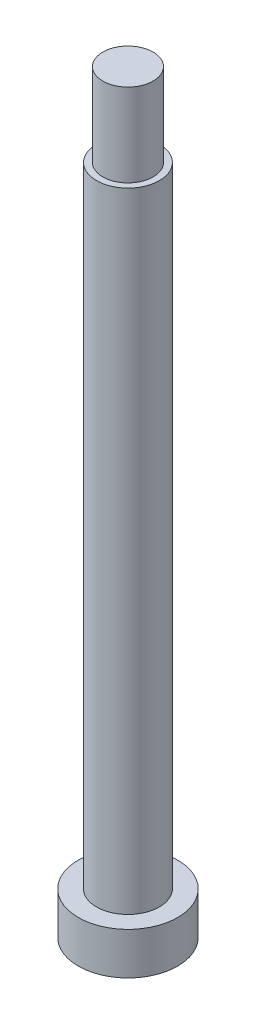
ISO-10303-21;
HEADER;
FILE_DESCRIPTION(('STEP AP214'),'2;1');
FILE_NAME('part.step','',(''),(''),'','','');
FILE_SCHEMA(('AUTOMOTIVE_DESIGN { 1 0 10303 214 1 1 1 1 }'));
ENDSEC;
DATA;
#1=APPLICATION_CONTEXT('core data for automotive mechanical design processes');
#2=APPLICATION_PROTOCOL_DEFINITION('international standard','automotive_design',2000,#1);
#3=PRODUCT_CONTEXT('',#1,'mechanical');
#4=PRODUCT('Part','Part','',(#3));
#5=PRODUCT_RELATED_PRODUCT_CATEGORY('part','',(#4));
#6=PRODUCT_DEFINITION_FORMATION('','',#4);
#7=PRODUCT_DEFINITION_CONTEXT('part definition',#1,'design');
#8=PRODUCT_DEFINITION('design','',#6,#7);
#9=PRODUCT_DEFINITION_SHAPE('','',#8);
#10=(LENGTH_UNIT() NAMED_UNIT(*) SI_UNIT(.MILLI.,.METRE.));
#11=(NAMED_UNIT(*) PLANE_ANGLE_UNIT() SI_UNIT($,.RADIAN.));
#12=(NAMED_UNIT(*) SI_UNIT($,.STERADIAN.) SOLID_ANGLE_UNIT());
#13=UNCERTAINTY_MEASURE_WITH_UNIT(LENGTH_MEASURE(1.E-05),#10,'distance_accuracy_value','');
#14=(GEOMETRIC_REPRESENTATION_CONTEXT(3) GLOBAL_UNCERTAINTY_ASSIGNED_CONTEXT((#13)) GLOBAL_UNIT_ASSIGNED_CONTEXT((#10,
#11,#12)) REPRESENTATION_CONTEXT('',''));
#15=CARTESIAN_POINT('',(0.,0.,0.));
#16=DIRECTION('',(0.,0.,1.));
#17=DIRECTION('',(1.,0.,0.));
#18=AXIS2_PLACEMENT_3D('',#15,#16,#17);
#19=CARTESIAN_POINT('',(0.,119.9,0.));
#20=DIRECTION('',(0.,-1.,0.));
#21=DIRECTION('',(0.,0.,-1.));
#22=AXIS2_PLACEMENT_3D('',#19,#20,#21);
#23=CYLINDRICAL_SURFACE('',#22,4.);
#24=CARTESIAN_POINT('',(0.,106.7,0.));
#25=DIRECTION('',(0.,1.,0.));
#26=DIRECTION('',(0.,0.,1.));
#27=AXIS2_PLACEMENT_3D('',#24,#25,#26);
#28=CIRCLE('',#27,4.);
#29=CARTESIAN_POINT('',(0.,106.7,4.));
#30=VERTEX_POINT('',#29);
#31=EDGE_CURVE('E579',#30,#30,#28,.T.);
#32=ORIENTED_EDGE('',*,*,#31,.T.);
#33=EDGE_LOOP('',(#32));
#34=FACE_BOUND('',#33,.T.);
#35=CARTESIAN_POINT('',(0.,119.9,0.));
#36=DIRECTION('',(0.,1.,0.));
#37=DIRECTION('',(0.,0.,1.));
#38=AXIS2_PLACEMENT_3D('',#35,#36,#37);
#39=CIRCLE('',#38,4.);
#40=CARTESIAN_POINT('',(0.,119.9,4.));
#41=VERTEX_POINT('',#40);
#42=EDGE_CURVE('E12',#41,#41,#39,.T.);
#43=ORIENTED_EDGE('',*,*,#42,.F.);
#44=EDGE_LOOP('',(#43));
#45=FACE_BOUND('',#44,.T.);
#46=ADVANCED_FACE('F464',(#34,#45),#23,.T.);
#47=CARTESIAN_POINT('',(0.,119.9,0.));
#48=DIRECTION('',(0.,1.,0.));
#49=DIRECTION('',(0.,0.,1.));
#50=AXIS2_PLACEMENT_3D('',#47,#48,#49);
#51=PLANE('',#50);
#52=ORIENTED_EDGE('',*,*,#42,.T.);
#53=EDGE_LOOP('',(#52));
#54=FACE_BOUND('',#53,.T.);
#55=ADVANCED_FACE('F587',(#54),#51,.T.);
#56=CARTESIAN_POINT('',(0.,106.7,0.));
#57=DIRECTION('',(0.,-1.,0.));
#58=DIRECTION('',(0.,0.,-1.));
#59=AXIS2_PLACEMENT_3D('',#56,#57,#58);
#60=CYLINDRICAL_SURFACE('',#59,5.);
#61=CARTESIAN_POINT('',(0.,6.7,0.));
#62=DIRECTION('',(0.,1.,0.));
#63=DIRECTION('',(0.,0.,1.));
#64=AXIS2_PLACEMENT_3D('',#61,#62,#63);
#65=CIRCLE('',#64,5.);
#66=CARTESIAN_POINT('',(0.,6.70000000000001,-5.));
#67=VERTEX_POINT('',#66);
#68=EDGE_CURVE('E575',#67,#67,#65,.T.);
#69=CARTESIAN_POINT('',(0.,106.7,0.));
#70=DIRECTION('',(0.,1.,0.));
#71=DIRECTION('',(0.,0.,1.));
#72=AXIS2_PLACEMENT_3D('',#69,#70,#71);
#73=CIRCLE('',#72,5.);
#74=CARTESIAN_POINT('',(0.,106.7,-5.));
#75=VERTEX_POINT('',#74);
#76=EDGE_CURVE('E471',#75,#75,#73,.T.);
#77=CARTESIAN_POINT('',(0.,6.70000000000001,-5.));
#78=CARTESIAN_POINT('',(0.,7.74166666666668,-5.));
#79=CARTESIAN_POINT('',(0.,8.78333333333335,-5.));
#80=CARTESIAN_POINT('',(0.,10.8666666666667,-5.));
#81=CARTESIAN_POINT('',(0.,11.9083333333333,-5.));
#82=CARTESIAN_POINT('',(0.,13.9916666666667,-5.));
#83=CARTESIAN_POINT('',(0.,15.0333333333333,-5.));
#84=CARTESIAN_POINT('',(0.,17.1166666666667,-5.));
#85=CARTESIAN_POINT('',(0.,18.1583333333333,-5.));
#86=CARTESIAN_POINT('',(0.,20.2416666666667,-5.));
#87=CARTESIAN_POINT('',(0.,21.2833333333333,-5.));
#88=CARTESIAN_POINT('',(0.,23.3666666666667,-5.));
#89=CARTESIAN_POINT('',(0.,24.4083333333333,-5.));
#90=CARTESIAN_POINT('',(0.,26.4916666666667,-5.));
#91=CARTESIAN_POINT('',(0.,27.5333333333333,-5.));
#92=CARTESIAN_POINT('',(0.,29.6166666666667,-5.));
#93=CARTESIAN_POINT('',(0.,30.6583333333333,-5.));
#94=CARTESIAN_POINT('',(0.,32.7416666666667,-5.));
#95=CARTESIAN_POINT('',(0.,33.7833333333333,-5.));
#96=CARTESIAN_POINT('',(0.,35.8666666666667,-5.));
#97=CARTESIAN_POINT('',(0.,36.9083333333333,-5.));
#98=CARTESIAN_POINT('',(0.,38.9916666666667,-5.));
#99=CARTESIAN_POINT('',(0.,40.0333333333333,-5.));
#100=CARTESIAN_POINT('',(0.,42.1166666666667,-5.));
#101=CARTESIAN_POINT('',(0.,43.1583333333333,-5.));
#102=CARTESIAN_POINT('',(0.,45.2416666666667,-5.));
#103=CARTESIAN_POINT('',(0.,46.2833333333333,-5.));
#104=CARTESIAN_POINT('',(0.,48.3666666666667,-5.));
#105=CARTESIAN_POINT('',(0.,49.4083333333333,-5.));
#106=CARTESIAN_POINT('',(0.,51.4916666666667,-5.));
#107=CARTESIAN_POINT('',(0.,52.5333333333333,-5.));
#108=CARTESIAN_POINT('',(0.,54.6166666666667,-5.));
#109=CARTESIAN_POINT('',(0.,55.6583333333333,-5.));
#110=CARTESIAN_POINT('',(0.,57.7416666666667,-5.));
#111=CARTESIAN_POINT('',(0.,58.7833333333333,-5.));
#112=CARTESIAN_POINT('',(0.,60.8666666666667,-5.));
#113=CARTESIAN_POINT('',(0.,61.9083333333333,-5.));
#114=CARTESIAN_POINT('',(0.,63.9916666666667,-5.));
#115=CARTESIAN_POINT('',(0.,65.0333333333333,-5.));
#116=CARTESIAN_POINT('',(0.,67.1166666666667,-5.));
#117=CARTESIAN_POINT('',(0.,68.1583333333333,-5.));
#118=CARTESIAN_POINT('',(0.,70.2416666666667,-5.));
#119=CARTESIAN_POINT('',(0.,71.2833333333333,-5.));
#120=CARTESIAN_POINT('',(0.,73.3666666666667,-5.));
#121=CARTESIAN_POINT('',(0.,74.4083333333333,-5.));
#122=CARTESIAN_POINT('',(0.,76.4916666666666,-5.));
#123=CARTESIAN_POINT('',(0.,77.5333333333333,-5.));
#124=CARTESIAN_POINT('',(0.,79.6166666666667,-5.));
#125=CARTESIAN_POINT('',(0.,80.6583333333333,-5.));
#126=CARTESIAN_POINT('',(0.,82.7416666666667,-5.));
#127=CARTESIAN_POINT('',(0.,83.7833333333333,-5.));
#128=CARTESIAN_POINT('',(0.,85.8666666666667,-5.));
#129=CARTESIAN_POINT('',(0.,86.9083333333333,-5.));
#130=CARTESIAN_POINT('',(0.,88.9916666666666,-5.));
#131=CARTESIAN_POINT('',(0.,90.0333333333333,-5.));
#132=CARTESIAN_POINT('',(0.,92.1166666666666,-5.));
#133=CARTESIAN_POINT('',(0.,93.1583333333333,-5.));
#134=CARTESIAN_POINT('',(0.,95.2416666666667,-5.));
#135=CARTESIAN_POINT('',(0.,96.2833333333333,-5.));
#136=CARTESIAN_POINT('',(0.,98.3666666666667,-5.));
#137=CARTESIAN_POINT('',(0.,99.4083333333333,-5.));
#138=CARTESIAN_POINT('',(0.,101.491666666667,-5.));
#139=CARTESIAN_POINT('',(0.,102.533333333333,-5.));
#140=CARTESIAN_POINT('',(0.,104.616666666667,-5.));
#141=CARTESIAN_POINT('',(0.,105.658333333333,-5.));
#142=CARTESIAN_POINT('',(0.,106.7,-5.));
#143=B_SPLINE_CURVE_WITH_KNOTS('',3,(#77,#78,#79,#80,#81,#82,#83,#84,#85,#86,#87,#88,#89,#90,
#91,#92,#93,#94,#95,#96,#97,#98,#99,#100,#101,#102,#103,#104,#105,#106,#107,#108,#109,#110,#111,
#112,#113,#114,#115,#116,#117,#118,#119,#120,#121,#122,#123,#124,#125,#126,#127,#128,#129,#130,
#131,#132,#133,#134,#135,#136,#137,#138,#139,#140,#141,#142),.UNSPECIFIED.,.F.,.F.,(4,2,2,2,2,2,
2,2,2,2,2,2,2,2,2,2,2,2,2,2,2,2,2,2,2,2,2,2,2,2,2,2,4),(0.,3.125,6.25000000000001,
9.37499999999999,12.5,15.625,18.75,21.875,25.,28.125,31.25,34.375,37.5,40.625,43.75,46.875,50.,
53.125,56.25,59.375,62.5,65.625,68.75,71.875,75.,78.125,81.25,84.375,87.5,90.625,93.75,96.875,
100.),.UNSPECIFIED.);
#144=EDGE_CURVE('BSEAM590',#67,#75,#143,.T.);
#145=ORIENTED_EDGE('',*,*,#68,.T.);
#146=ORIENTED_EDGE('',*,*,#76,.F.);
#147=ORIENTED_EDGE('',*,*,#144,.T.);
#148=ORIENTED_EDGE('',*,*,#144,.F.);
#149=EDGE_LOOP('',(#145,#147,#146,#148));
#150=FACE_BOUND('',#149,.T.);
#151=ADVANCED_FACE('F590',(#150),#60,.T.);
#152=CARTESIAN_POINT('',(0.,106.7,0.));
#153=DIRECTION('',(0.,1.,0.));
#154=DIRECTION('',(0.,0.,1.));
#155=AXIS2_PLACEMENT_3D('',#152,#153,#154);
#156=PLANE('',#155);
#157=ORIENTED_EDGE('',*,*,#31,.F.);
#158=EDGE_LOOP('',(#157));
#159=FACE_BOUND('',#158,.T.);
#160=ORIENTED_EDGE('',*,*,#76,.T.);
#161=EDGE_LOOP('',(#160));
#162=FACE_BOUND('',#161,.T.);
#163=ADVANCED_FACE('F582',(#159,#162),#156,.T.);
#164=CARTESIAN_POINT('',(0.,6.7,0.));
#165=DIRECTION('',(0.,-1.,0.));
#166=DIRECTION('',(0.,0.,-1.));
#167=AXIS2_PLACEMENT_3D('',#164,#165,#166);
#168=CYLINDRICAL_SURFACE('',#167,7.9);
#169=CARTESIAN_POINT('',(0.,6.7,0.));
#170=DIRECTION('',(0.,1.,0.));
#171=DIRECTION('',(0.,0.,1.));
#172=AXIS2_PLACEMENT_3D('',#169,#170,#171);
#173=CIRCLE('',#172,7.9);
#174=CARTESIAN_POINT('',(0.,6.7,7.9));
#175=VERTEX_POINT('',#174);
#176=EDGE_CURVE('E574',#175,#175,#173,.T.);
#177=ORIENTED_EDGE('',*,*,#176,.F.);
#178=EDGE_LOOP('',(#177));
#179=FACE_BOUND('',#178,.T.);
#180=CARTESIAN_POINT('',(0.,0.,0.));
#181=DIRECTION('',(0.,1.,0.));
#182=DIRECTION('',(0.,0.,1.));
#183=AXIS2_PLACEMENT_3D('',#180,#181,#182);
#184=CIRCLE('',#183,7.9);
#185=CARTESIAN_POINT('',(0.,0.,7.9));
#186=VERTEX_POINT('',#185);
#187=EDGE_CURVE('E566',#186,#186,#184,.T.);
#188=ORIENTED_EDGE('',*,*,#187,.T.);
#189=EDGE_LOOP('',(#188));
#190=FACE_BOUND('',#189,.T.);
#191=ADVANCED_FACE('F597',(#179,#190),#168,.T.);
#192=CARTESIAN_POINT('',(0.,6.7,0.));
#193=DIRECTION('',(0.,1.,0.));
#194=DIRECTION('',(0.,0.,1.));
#195=AXIS2_PLACEMENT_3D('',#192,#193,#194);
#196=PLANE('',#195);
#197=ORIENTED_EDGE('',*,*,#68,.F.);
#198=EDGE_LOOP('',(#197));
#199=FACE_BOUND('',#198,.T.);
#200=ORIENTED_EDGE('',*,*,#176,.T.);
#201=EDGE_LOOP('',(#200));
#202=FACE_BOUND('',#201,.T.);
#203=ADVANCED_FACE('F633',(#199,#202),#196,.T.);
#204=CARTESIAN_POINT('',(0.,0.,0.));
#205=DIRECTION('',(0.,1.,0.));
#206=DIRECTION('',(0.,0.,1.));
#207=AXIS2_PLACEMENT_3D('',#204,#205,#206);
#208=PLANE('',#207);
#209=DIRECTION('',(-0.866025403784439,0.,0.5));
#210=VECTOR('',#209,1.);
#211=CARTESIAN_POINT('',(2.5,0.,1.44337567297406));
#212=LINE('',#211,#210);
#213=CARTESIAN_POINT('',(2.5,0.,1.44337567297406));
#214=VERTEX_POINT('',#213);
#215=CARTESIAN_POINT('',(0.,0.,2.88675134594813));
#216=VERTEX_POINT('',#215);
#217=EDGE_CURVE('E551',#214,#216,#212,.T.);
#218=ORIENTED_EDGE('',*,*,#217,.F.);
#219=DIRECTION('',(0.,0.,1.));
#220=VECTOR('',#219,1.);
#221=CARTESIAN_POINT('',(2.5,0.,-1.44337567297406));
#222=LINE('',#221,#220);
#223=CARTESIAN_POINT('',(2.5,0.,-1.44337567297406));
#224=VERTEX_POINT('',#223);
#225=EDGE_CURVE('E477',#224,#214,#222,.T.);
#226=ORIENTED_EDGE('',*,*,#225,.F.);
#227=DIRECTION('',(0.866025403784439,0.,0.5));
#228=VECTOR('',#227,1.);
#229=CARTESIAN_POINT('',(0.,0.,-2.88675134594813));
#230=LINE('',#229,#228);
#231=CARTESIAN_POINT('',(0.,0.,-2.88675134594813));
#232=VERTEX_POINT('',#231);
#233=EDGE_CURVE('E565',#232,#224,#230,.T.);
#234=ORIENTED_EDGE('',*,*,#233,.F.);
#235=DIRECTION('',(0.866025403784439,0.,-0.5));
#236=VECTOR('',#235,1.);
#237=CARTESIAN_POINT('',(-2.5,0.,-1.44337567297407));
#238=LINE('',#237,#236);
#239=CARTESIAN_POINT('',(-2.5,0.,-1.44337567297407));
#240=VERTEX_POINT('',#239);
#241=EDGE_CURVE('E557',#240,#232,#238,.T.);
#242=ORIENTED_EDGE('',*,*,#241,.F.);
#243=DIRECTION('',(0.,0.,-1.));
#244=VECTOR('',#243,1.);
#245=CARTESIAN_POINT('',(-2.5,0.,1.44337567297406));
#246=LINE('',#245,#244);
#247=CARTESIAN_POINT('',(-2.5,0.,1.44337567297406));
#248=VERTEX_POINT('',#247);
#249=EDGE_CURVE('E530',#248,#240,#246,.T.);
#250=ORIENTED_EDGE('',*,*,#249,.F.);
#251=DIRECTION('',(-0.866025403784439,0.,-0.5));
#252=VECTOR('',#251,1.);
#253=CARTESIAN_POINT('',(0.,0.,2.88675134594813));
#254=LINE('',#253,#252);
#255=EDGE_CURVE('E558',#216,#248,#254,.T.);
#256=ORIENTED_EDGE('',*,*,#255,.F.);
#257=EDGE_LOOP('',(#218,#226,#234,#242,#250,#256));
#258=FACE_BOUND('',#257,.T.);
#259=ORIENTED_EDGE('',*,*,#187,.F.);
#260=EDGE_LOOP('',(#259));
#261=FACE_BOUND('',#260,.T.);
#262=ADVANCED_FACE('F626',(#258,#261),#208,.F.);
#263=CARTESIAN_POINT('',(2.5,3.,-1.44337567297406));
#264=DIRECTION('',(1.,0.,0.));
#265=DIRECTION('',(0.,0.,-1.));
#266=AXIS2_PLACEMENT_3D('',#263,#264,#265);
#267=PLANE('',#266);
#268=ORIENTED_EDGE('',*,*,#225,.T.);
#269=DIRECTION('',(0.,-1.,0.));
#270=VECTOR('',#269,1.);
#271=CARTESIAN_POINT('',(2.5,3.,1.44337567297406));
#272=LINE('',#271,#270);
#273=CARTESIAN_POINT('',(2.5,3.,1.44337567297406));
#274=VERTEX_POINT('',#273);
#275=EDGE_CURVE('E508',#274,#214,#272,.T.);
#276=ORIENTED_EDGE('',*,*,#275,.F.);
#277=DIRECTION('',(0.,0.,1.));
#278=VECTOR('',#277,1.);
#279=CARTESIAN_POINT('',(2.5,3.,-1.44337567297406));
#280=LINE('',#279,#278);
#281=CARTESIAN_POINT('',(2.5,3.,-1.44337567297406));
#282=VERTEX_POINT('',#281);
#283=EDGE_CURVE('E562',#282,#274,#280,.T.);
#284=ORIENTED_EDGE('',*,*,#283,.F.);
#285=DIRECTION('',(0.,-1.,0.));
#286=VECTOR('',#285,1.);
#287=CARTESIAN_POINT('',(2.5,3.,-1.44337567297406));
#288=LINE('',#287,#286);
#289=EDGE_CURVE('E487',#282,#224,#288,.T.);
#290=ORIENTED_EDGE('',*,*,#289,.T.);
#291=EDGE_LOOP('',(#268,#276,#284,#290));
#292=FACE_BOUND('',#291,.T.);
#293=ADVANCED_FACE('F635',(#292),#267,.F.);
#294=CARTESIAN_POINT('',(0.,3.,-2.88675134594813));
#295=DIRECTION('',(0.5,0.,-0.866025403784439));
#296=DIRECTION('',(-0.866025403784439,0.,-0.5));
#297=AXIS2_PLACEMENT_3D('',#294,#295,#296);
#298=PLANE('',#297);
#299=ORIENTED_EDGE('',*,*,#233,.T.);
#300=ORIENTED_EDGE('',*,*,#289,.F.);
#301=DIRECTION('',(0.866025403784439,0.,0.5));
#302=VECTOR('',#301,1.);
#303=CARTESIAN_POINT('',(0.,3.,-2.88675134594813));
#304=LINE('',#303,#302);
#305=CARTESIAN_POINT('',(0.,3.,-2.88675134594813));
#306=VERTEX_POINT('',#305);
#307=EDGE_CURVE('E538',#306,#282,#304,.T.);
#308=ORIENTED_EDGE('',*,*,#307,.F.);
#309=DIRECTION('',(0.,-1.,0.));
#310=VECTOR('',#309,1.);
#311=CARTESIAN_POINT('',(0.,3.,-2.88675134594813));
#312=LINE('',#311,#310);
#313=EDGE_CURVE('E532',#306,#232,#312,.T.);
#314=ORIENTED_EDGE('',*,*,#313,.T.);
#315=EDGE_LOOP('',(#299,#300,#308,#314));
#316=FACE_BOUND('',#315,.T.);
#317=ADVANCED_FACE('F662',(#316),#298,.F.);
#318=CARTESIAN_POINT('',(-2.5,3.,-1.44337567297407));
#319=DIRECTION('',(-0.5,0.,-0.866025403784439));
#320=DIRECTION('',(-0.866025403784439,0.,0.5));
#321=AXIS2_PLACEMENT_3D('',#318,#319,#320);
#322=PLANE('',#321);
#323=ORIENTED_EDGE('',*,*,#241,.T.);
#324=ORIENTED_EDGE('',*,*,#313,.F.);
#325=DIRECTION('',(0.866025403784439,0.,-0.5));
#326=VECTOR('',#325,1.);
#327=CARTESIAN_POINT('',(-2.5,3.,-1.44337567297407));
#328=LINE('',#327,#326);
#329=CARTESIAN_POINT('',(-2.5,3.,-1.44337567297407));
#330=VERTEX_POINT('',#329);
#331=EDGE_CURVE('E533',#330,#306,#328,.T.);
#332=ORIENTED_EDGE('',*,*,#331,.F.);
#333=DIRECTION('',(0.,-1.,0.));
#334=VECTOR('',#333,1.);
#335=CARTESIAN_POINT('',(-2.5,3.,-1.44337567297407));
#336=LINE('',#335,#334);
#337=EDGE_CURVE('E517',#330,#240,#336,.T.);
#338=ORIENTED_EDGE('',*,*,#337,.T.);
#339=EDGE_LOOP('',(#323,#324,#332,#338));
#340=FACE_BOUND('',#339,.T.);
#341=ADVANCED_FACE('F539',(#340),#322,.F.);
#342=CARTESIAN_POINT('',(-2.5,3.,1.44337567297406));
#343=DIRECTION('',(-1.,0.,0.));
#344=DIRECTION('',(0.,0.,1.));
#345=AXIS2_PLACEMENT_3D('',#342,#343,#344);
#346=PLANE('',#345);
#347=ORIENTED_EDGE('',*,*,#249,.T.);
#348=ORIENTED_EDGE('',*,*,#337,.F.);
#349=DIRECTION('',(0.,0.,-1.));
#350=VECTOR('',#349,1.);
#351=CARTESIAN_POINT('',(-2.5,3.,1.44337567297406));
#352=LINE('',#351,#350);
#353=CARTESIAN_POINT('',(-2.5,3.,1.44337567297406));
#354=VERTEX_POINT('',#353);
#355=EDGE_CURVE('E522',#354,#330,#352,.T.);
#356=ORIENTED_EDGE('',*,*,#355,.F.);
#357=DIRECTION('',(0.,-1.,0.));
#358=VECTOR('',#357,1.);
#359=CARTESIAN_POINT('',(-2.5,3.,1.44337567297406));
#360=LINE('',#359,#358);
#361=EDGE_CURVE('E535',#354,#248,#360,.T.);
#362=ORIENTED_EDGE('',*,*,#361,.T.);
#363=EDGE_LOOP('',(#347,#348,#356,#362));
#364=FACE_BOUND('',#363,.T.);
#365=ADVANCED_FACE('F525',(#364),#346,.F.);
#366=CARTESIAN_POINT('',(0.,3.,2.88675134594813));
#367=DIRECTION('',(-0.5,0.,0.866025403784438));
#368=DIRECTION('',(0.866025403784439,0.,0.5));
#369=AXIS2_PLACEMENT_3D('',#366,#367,#368);
#370=PLANE('',#369);
#371=ORIENTED_EDGE('',*,*,#255,.T.);
#372=ORIENTED_EDGE('',*,*,#361,.F.);
#373=DIRECTION('',(-0.866025403784439,0.,-0.5));
#374=VECTOR('',#373,1.);
#375=CARTESIAN_POINT('',(0.,3.,2.88675134594813));
#376=LINE('',#375,#374);
#377=CARTESIAN_POINT('',(0.,3.,2.88675134594813));
#378=VERTEX_POINT('',#377);
#379=EDGE_CURVE('E544',#378,#354,#376,.T.);
#380=ORIENTED_EDGE('',*,*,#379,.F.);
#381=DIRECTION('',(0.,-1.,0.));
#382=VECTOR('',#381,1.);
#383=CARTESIAN_POINT('',(0.,3.,2.88675134594813));
#384=LINE('',#383,#382);
#385=EDGE_CURVE('E567',#378,#216,#384,.T.);
#386=ORIENTED_EDGE('',*,*,#385,.T.);
#387=EDGE_LOOP('',(#371,#372,#380,#386));
#388=FACE_BOUND('',#387,.T.);
#389=ADVANCED_FACE('F682',(#388),#370,.F.);
#390=CARTESIAN_POINT('',(2.5,3.,1.44337567297406));
#391=DIRECTION('',(0.5,0.,0.866025403784438));
#392=DIRECTION('',(0.866025403784439,0.,-0.5));
#393=AXIS2_PLACEMENT_3D('',#390,#391,#392);
#394=PLANE('',#393);
#395=ORIENTED_EDGE('',*,*,#217,.T.);
#396=ORIENTED_EDGE('',*,*,#385,.F.);
#397=DIRECTION('',(-0.866025403784439,0.,0.5));
#398=VECTOR('',#397,1.);
#399=CARTESIAN_POINT('',(2.5,3.,1.44337567297406));
#400=LINE('',#399,#398);
#401=EDGE_CURVE('E550',#274,#378,#400,.T.);
#402=ORIENTED_EDGE('',*,*,#401,.F.);
#403=ORIENTED_EDGE('',*,*,#275,.T.);
#404=EDGE_LOOP('',(#395,#396,#402,#403));
#405=FACE_BOUND('',#404,.T.);
#406=ADVANCED_FACE('F687',(#405),#394,.F.);
#407=CARTESIAN_POINT('',(0.,3.,0.));
#408=DIRECTION('',(0.,-1.,0.));
#409=DIRECTION('',(0.,0.,-1.));
#410=AXIS2_PLACEMENT_3D('',#407,#408,#409);
#411=PLANE('',#410);
#412=ORIENTED_EDGE('',*,*,#283,.T.);
#413=ORIENTED_EDGE('',*,*,#401,.T.);
#414=ORIENTED_EDGE('',*,*,#379,.T.);
#415=ORIENTED_EDGE('',*,*,#355,.T.);
#416=ORIENTED_EDGE('',*,*,#331,.T.);
#417=ORIENTED_EDGE('',*,*,#307,.T.);
#418=EDGE_LOOP('',(#412,#413,#414,#415,#416,#417));
#419=FACE_BOUND('',#418,.T.);
#420=ADVANCED_FACE('F545',(#419),#411,.T.);
#421=CLOSED_SHELL('',(#46,#55,#151,#163,#191,#203,#262,#293,#317,#341,#365,#389,#406,#420));
#422=MANIFOLD_SOLID_BREP('B2',#421);
#423=ADVANCED_BREP_SHAPE_REPRESENTATION('',(#18,#422),#14);
#424=SHAPE_DEFINITION_REPRESENTATION(#9,#423);
ENDSEC;
END-ISO-10303-21;
